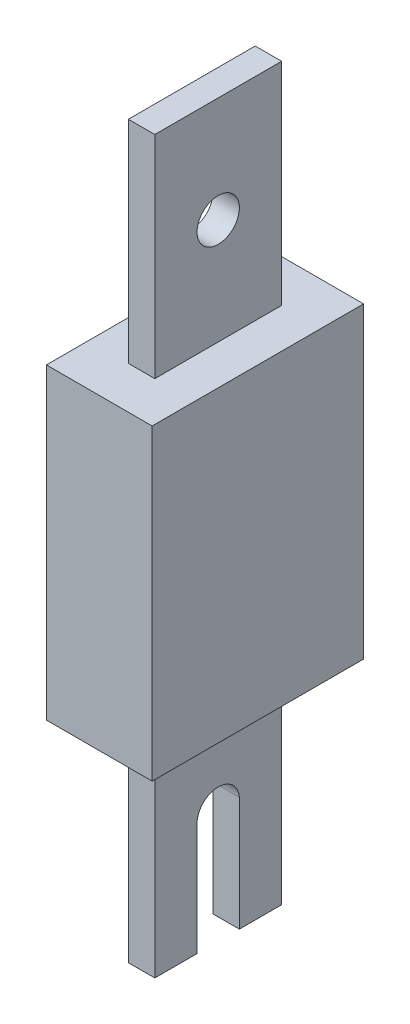
ISO-10303-21;
HEADER;
FILE_DESCRIPTION(('STEP AP214'),'2;1');
FILE_NAME('part.step','',(''),(''),'','','');
FILE_SCHEMA(('AUTOMOTIVE_DESIGN { 1 0 10303 214 1 1 1 1 }'));
ENDSEC;
DATA;
#1=APPLICATION_CONTEXT('core data for automotive mechanical design processes');
#2=APPLICATION_PROTOCOL_DEFINITION('international standard','automotive_design',2000,#1);
#3=PRODUCT_CONTEXT('',#1,'mechanical');
#4=PRODUCT('Part','Part','',(#3));
#5=PRODUCT_RELATED_PRODUCT_CATEGORY('part','',(#4));
#6=PRODUCT_DEFINITION_FORMATION('','',#4);
#7=PRODUCT_DEFINITION_CONTEXT('part definition',#1,'design');
#8=PRODUCT_DEFINITION('design','',#6,#7);
#9=PRODUCT_DEFINITION_SHAPE('','',#8);
#10=(LENGTH_UNIT() NAMED_UNIT(*) SI_UNIT(.MILLI.,.METRE.));
#11=(NAMED_UNIT(*) PLANE_ANGLE_UNIT() SI_UNIT($,.RADIAN.));
#12=(NAMED_UNIT(*) SI_UNIT($,.STERADIAN.) SOLID_ANGLE_UNIT());
#13=UNCERTAINTY_MEASURE_WITH_UNIT(LENGTH_MEASURE(1.E-05),#10,'distance_accuracy_value','');
#14=(GEOMETRIC_REPRESENTATION_CONTEXT(3) GLOBAL_UNCERTAINTY_ASSIGNED_CONTEXT((#13)) GLOBAL_UNIT_ASSIGNED_CONTEXT((#10,
#11,#12)) REPRESENTATION_CONTEXT('',''));
#15=CARTESIAN_POINT('',(0.,0.,0.));
#16=DIRECTION('',(0.,0.,1.));
#17=DIRECTION('',(1.,0.,0.));
#18=AXIS2_PLACEMENT_3D('',#15,#16,#17);
#19=CARTESIAN_POINT('',(-16.21295552744,48.217601526628,10.));
#20=DIRECTION('',(-1.,0.,0.));
#21=DIRECTION('',(0.,0.,1.));
#22=AXIS2_PLACEMENT_3D('',#19,#20,#21);
#23=CYLINDRICAL_SURFACE('',#22,2.);
#24=CARTESIAN_POINT('',(-13.71295552744,48.217601526628,10.));
#25=DIRECTION('',(-1.,0.,0.));
#26=DIRECTION('',(0.,0.,1.));
#27=AXIS2_PLACEMENT_3D('',#24,#25,#26);
#28=CIRCLE('',#27,2.);
#29=CARTESIAN_POINT('',(-13.71295552744,48.217601526628,12.));
#30=VERTEX_POINT('',#29);
#31=EDGE_CURVE('E20',#30,#30,#28,.T.);
#32=ORIENTED_EDGE('',*,*,#31,.F.);
#33=EDGE_LOOP('',(#32));
#34=FACE_BOUND('',#33,.T.);
#35=CARTESIAN_POINT('',(-16.21295552744,48.217601526628,10.));
#36=DIRECTION('',(-1.,0.,0.));
#37=DIRECTION('',(0.,0.,1.));
#38=AXIS2_PLACEMENT_3D('',#35,#36,#37);
#39=CIRCLE('',#38,2.);
#40=CARTESIAN_POINT('',(-16.21295552744,48.217601526628,12.));
#41=VERTEX_POINT('',#40);
#42=EDGE_CURVE('E176',#41,#41,#39,.T.);
#43=ORIENTED_EDGE('',*,*,#42,.T.);
#44=EDGE_LOOP('',(#43));
#45=FACE_BOUND('',#44,.T.);
#46=ADVANCED_FACE('F17',(#34,#45),#23,.F.);
#47=CARTESIAN_POINT('',(-16.21295552744,58.217601526628,20.));
#48=DIRECTION('',(0.,1.,0.));
#49=DIRECTION('',(0.,0.,1.));
#50=AXIS2_PLACEMENT_3D('',#47,#48,#49);
#51=PLANE('',#50);
#52=DIRECTION('',(1.,0.,0.));
#53=VECTOR('',#52,1.);
#54=CARTESIAN_POINT('',(3.787044472554,58.217601526628,16.));
#55=LINE('',#54,#53);
#56=CARTESIAN_POINT('',(-16.21295552744,58.217601526628,16.));
#57=VERTEX_POINT('',#56);
#58=CARTESIAN_POINT('',(-13.71295552744,58.217601526628,16.));
#59=VERTEX_POINT('',#58);
#60=EDGE_CURVE('E179',#57,#59,#55,.T.);
#61=ORIENTED_EDGE('',*,*,#60,.T.);
#62=DIRECTION('',(0.,0.,1.));
#63=VECTOR('',#62,1.);
#64=CARTESIAN_POINT('',(-13.71295552744,58.217601526628,20.));
#65=LINE('',#64,#63);
#66=CARTESIAN_POINT('',(-13.71295552744,58.217601526628,4.));
#67=VERTEX_POINT('',#66);
#68=EDGE_CURVE('E181',#67,#59,#65,.T.);
#69=ORIENTED_EDGE('',*,*,#68,.F.);
#70=DIRECTION('',(1.,0.,0.));
#71=VECTOR('',#70,1.);
#72=CARTESIAN_POINT('',(3.787044472554,58.217601526628,4.));
#73=LINE('',#72,#71);
#74=CARTESIAN_POINT('',(-16.21295552744,58.217601526628,4.));
#75=VERTEX_POINT('',#74);
#76=EDGE_CURVE('E187',#67,#75,#73,.F.);
#77=ORIENTED_EDGE('',*,*,#76,.T.);
#78=DIRECTION('',(0.,0.,1.));
#79=VECTOR('',#78,1.);
#80=CARTESIAN_POINT('',(-16.21295552744,58.217601526628,20.));
#81=LINE('',#80,#79);
#82=EDGE_CURVE('E166',#75,#57,#81,.T.);
#83=ORIENTED_EDGE('',*,*,#82,.T.);
#84=EDGE_LOOP('',(#61,#69,#77,#83));
#85=FACE_BOUND('',#84,.T.);
#86=ADVANCED_FACE('F384',(#85),#51,.T.);
#87=CARTESIAN_POINT('',(0.,-10.88239847337,20.));
#88=DIRECTION('',(0.,1.,0.));
#89=DIRECTION('',(0.,0.,1.));
#90=AXIS2_PLACEMENT_3D('',#87,#88,#89);
#91=PLANE('',#90);
#92=DIRECTION('',(-1.,0.,0.));
#93=VECTOR('',#92,1.);
#94=CARTESIAN_POINT('',(-6.212955527446,-10.88239847337,8.));
#95=LINE('',#94,#93);
#96=CARTESIAN_POINT('',(-13.71295552744,-10.88239847337,8.));
#97=VERTEX_POINT('',#96);
#98=CARTESIAN_POINT('',(-16.21295552744,-10.88239847337,8.));
#99=VERTEX_POINT('',#98);
#100=EDGE_CURVE('E140',#97,#99,#95,.T.);
#101=ORIENTED_EDGE('',*,*,#100,.T.);
#102=DIRECTION('',(0.,0.,1.));
#103=VECTOR('',#102,1.);
#104=CARTESIAN_POINT('',(-16.21295552744,-10.88239847337,20.));
#105=LINE('',#104,#103);
#106=CARTESIAN_POINT('',(-16.21295552744,-10.88239847337,4.));
#107=VERTEX_POINT('',#106);
#108=EDGE_CURVE('E154',#107,#99,#105,.T.);
#109=ORIENTED_EDGE('',*,*,#108,.F.);
#110=DIRECTION('',(1.,0.,0.));
#111=VECTOR('',#110,1.);
#112=CARTESIAN_POINT('',(3.787044472554,-10.88239847337,4.));
#113=LINE('',#112,#111);
#114=CARTESIAN_POINT('',(-13.71295552744,-10.88239847337,4.));
#115=VERTEX_POINT('',#114);
#116=EDGE_CURVE('E210',#107,#115,#113,.T.);
#117=ORIENTED_EDGE('',*,*,#116,.T.);
#118=DIRECTION('',(0.,0.,1.));
#119=VECTOR('',#118,1.);
#120=CARTESIAN_POINT('',(-13.71295552744,-10.88239847337,20.));
#121=LINE('',#120,#119);
#122=EDGE_CURVE('E203',#115,#97,#121,.T.);
#123=ORIENTED_EDGE('',*,*,#122,.T.);
#124=EDGE_LOOP('',(#101,#109,#117,#123));
#125=FACE_BOUND('',#124,.T.);
#126=ADVANCED_FACE('F386',(#125),#91,.F.);
#127=CARTESIAN_POINT('',(-6.212955527446,-0.08225252338699,8.));
#128=DIRECTION('',(0.,0.,-1.));
#129=DIRECTION('',(-1.,0.,0.));
#130=AXIS2_PLACEMENT_3D('',#127,#128,#129);
#131=PLANE('',#130);
#132=DIRECTION('',(0.,-1.,0.));
#133=VECTOR('',#132,1.);
#134=CARTESIAN_POINT('',(-16.21295552744,0.,8.));
#135=LINE('',#134,#133);
#136=CARTESIAN_POINT('',(-16.21295552744,-0.0822525233855761,7.99999999999989));
#137=VERTEX_POINT('',#136);
#138=EDGE_CURVE('E133',#99,#137,#135,.F.);
#139=ORIENTED_EDGE('',*,*,#138,.F.);
#140=ORIENTED_EDGE('',*,*,#100,.F.);
#141=DIRECTION('',(0.,-1.,0.));
#142=VECTOR('',#141,1.);
#143=CARTESIAN_POINT('',(-13.71295552744,0.,8.));
#144=LINE('',#143,#142);
#145=CARTESIAN_POINT('',(-13.71295552744,-0.0822525233855766,7.99999999999989));
#146=VERTEX_POINT('',#145);
#147=EDGE_CURVE('E136',#97,#146,#144,.F.);
#148=ORIENTED_EDGE('',*,*,#147,.T.);
#149=DIRECTION('',(-1.,0.,0.));
#150=VECTOR('',#149,1.);
#151=CARTESIAN_POINT('',(-6.212955527446,-0.082252523386974,7.99999999999978));
#152=LINE('',#151,#150);
#153=EDGE_CURVE('E128',#146,#137,#152,.T.);
#154=ORIENTED_EDGE('',*,*,#153,.T.);
#155=EDGE_LOOP('',(#139,#140,#148,#154));
#156=FACE_BOUND('',#155,.T.);
#157=ADVANCED_FACE('F130',(#156),#131,.F.);
#158=CARTESIAN_POINT('',(-6.212955527446,-0.237453291223,10.));
#159=DIRECTION('',(-1.,0.,0.));
#160=DIRECTION('',(0.,-1.,0.));
#161=AXIS2_PLACEMENT_3D('',#158,#159,#160);
#162=CYLINDRICAL_SURFACE('',#161,2.0060127812);
#163=CARTESIAN_POINT('',(-16.21295552744,-0.237453291222998,10.));
#164=DIRECTION('',(-1.,0.,0.));
#165=DIRECTION('',(0.,-1.,0.));
#166=AXIS2_PLACEMENT_3D('',#163,#164,#165);
#167=CIRCLE('',#166,2.0060127812);
#168=CARTESIAN_POINT('',(-16.21295552744,-0.082252523385585,12.));
#169=VERTEX_POINT('',#168);
#170=EDGE_CURVE('E144',#137,#169,#167,.F.);
#171=ORIENTED_EDGE('',*,*,#170,.F.);
#172=ORIENTED_EDGE('',*,*,#153,.F.);
#173=CARTESIAN_POINT('',(-13.71295552744,-0.237453291222999,10.));
#174=DIRECTION('',(-1.,0.,0.));
#175=DIRECTION('',(0.,-1.,0.));
#176=AXIS2_PLACEMENT_3D('',#173,#174,#175);
#177=CIRCLE('',#176,2.0060127812);
#178=CARTESIAN_POINT('',(-13.71295552744,-0.0822525233855853,12.));
#179=VERTEX_POINT('',#178);
#180=EDGE_CURVE('E239',#146,#179,#177,.F.);
#181=ORIENTED_EDGE('',*,*,#180,.T.);
#182=DIRECTION('',(1.,0.,0.));
#183=VECTOR('',#182,1.);
#184=CARTESIAN_POINT('',(-6.212955527446,-0.08225252338699,12.));
#185=LINE('',#184,#183);
#186=EDGE_CURVE('E139',#179,#169,#185,.F.);
#187=ORIENTED_EDGE('',*,*,#186,.T.);
#188=EDGE_LOOP('',(#171,#172,#181,#187));
#189=FACE_BOUND('',#188,.T.);
#190=ADVANCED_FACE('F145',(#189),#162,.F.);
#191=CARTESIAN_POINT('',(-6.212955527446,-0.08225252338699,12.));
#192=DIRECTION('',(0.,0.,1.));
#193=DIRECTION('',(1.,0.,0.));
#194=AXIS2_PLACEMENT_3D('',#191,#192,#193);
#195=PLANE('',#194);
#196=DIRECTION('',(0.,-1.,0.));
#197=VECTOR('',#196,1.);
#198=CARTESIAN_POINT('',(-16.21295552744,0.,12.));
#199=LINE('',#198,#197);
#200=CARTESIAN_POINT('',(-16.21295552744,-10.88239847337,12.));
#201=VERTEX_POINT('',#200);
#202=EDGE_CURVE('E164',#169,#201,#199,.T.);
#203=ORIENTED_EDGE('',*,*,#202,.F.);
#204=ORIENTED_EDGE('',*,*,#186,.F.);
#205=DIRECTION('',(0.,-1.,0.));
#206=VECTOR('',#205,1.);
#207=CARTESIAN_POINT('',(-13.71295552744,0.,12.));
#208=LINE('',#207,#206);
#209=CARTESIAN_POINT('',(-13.71295552744,-10.88239847337,12.));
#210=VERTEX_POINT('',#209);
#211=EDGE_CURVE('E197',#179,#210,#208,.T.);
#212=ORIENTED_EDGE('',*,*,#211,.T.);
#213=DIRECTION('',(1.,0.,0.));
#214=VECTOR('',#213,1.);
#215=CARTESIAN_POINT('',(0.,-10.88239847337,12.));
#216=LINE('',#215,#214);
#217=EDGE_CURVE('E189',#210,#201,#216,.F.);
#218=ORIENTED_EDGE('',*,*,#217,.T.);
#219=EDGE_LOOP('',(#203,#204,#212,#218));
#220=FACE_BOUND('',#219,.T.);
#221=ADVANCED_FACE('F325',(#220),#195,.F.);
#222=CARTESIAN_POINT('',(0.,-10.88239847337,20.));
#223=DIRECTION('',(0.,1.,0.));
#224=DIRECTION('',(0.,0.,1.));
#225=AXIS2_PLACEMENT_3D('',#222,#223,#224);
#226=PLANE('',#225);
#227=ORIENTED_EDGE('',*,*,#217,.F.);
#228=DIRECTION('',(0.,0.,1.));
#229=VECTOR('',#228,1.);
#230=CARTESIAN_POINT('',(-13.71295552744,-10.88239847337,20.));
#231=LINE('',#230,#229);
#232=CARTESIAN_POINT('',(-13.71295552744,-10.88239847337,16.));
#233=VERTEX_POINT('',#232);
#234=EDGE_CURVE('E194',#210,#233,#231,.T.);
#235=ORIENTED_EDGE('',*,*,#234,.T.);
#236=DIRECTION('',(1.,0.,0.));
#237=VECTOR('',#236,1.);
#238=CARTESIAN_POINT('',(3.787044472554,-10.88239847337,16.));
#239=LINE('',#238,#237);
#240=CARTESIAN_POINT('',(-16.21295552744,-10.88239847337,16.));
#241=VERTEX_POINT('',#240);
#242=EDGE_CURVE('E315',#233,#241,#239,.F.);
#243=ORIENTED_EDGE('',*,*,#242,.T.);
#244=DIRECTION('',(0.,0.,1.));
#245=VECTOR('',#244,1.);
#246=CARTESIAN_POINT('',(-16.21295552744,-10.88239847337,20.));
#247=LINE('',#246,#245);
#248=EDGE_CURVE('E156',#201,#241,#247,.T.);
#249=ORIENTED_EDGE('',*,*,#248,.F.);
#250=EDGE_LOOP('',(#227,#235,#243,#249));
#251=FACE_BOUND('',#250,.T.);
#252=ADVANCED_FACE('F328',(#251),#226,.F.);
#253=CARTESIAN_POINT('',(3.787044472554,58.217601526628,4.));
#254=DIRECTION('',(0.,0.,1.));
#255=DIRECTION('',(0.,-1.,0.));
#256=AXIS2_PLACEMENT_3D('',#253,#254,#255);
#257=PLANE('',#256);
#258=DIRECTION('',(1.,0.,0.));
#259=VECTOR('',#258,1.);
#260=CARTESIAN_POINT('',(0.,38.217601526628,4.));
#261=LINE('',#260,#259);
#262=CARTESIAN_POINT('',(-16.21295552744,38.217601526628,4.));
#263=VERTEX_POINT('',#262);
#264=CARTESIAN_POINT('',(-13.71295552744,38.217601526628,4.));
#265=VERTEX_POINT('',#264);
#266=EDGE_CURVE('E337',#263,#265,#261,.T.);
#267=ORIENTED_EDGE('',*,*,#266,.F.);
#268=DIRECTION('',(0.,1.,0.));
#269=VECTOR('',#268,1.);
#270=CARTESIAN_POINT('',(-16.21295552744,58.217601526628,4.));
#271=LINE('',#270,#269);
#272=EDGE_CURVE('E171',#263,#75,#271,.T.);
#273=ORIENTED_EDGE('',*,*,#272,.T.);
#274=ORIENTED_EDGE('',*,*,#76,.F.);
#275=DIRECTION('',(0.,1.,0.));
#276=VECTOR('',#275,1.);
#277=CARTESIAN_POINT('',(-13.71295552744,58.217601526628,4.));
#278=LINE('',#277,#276);
#279=EDGE_CURVE('E184',#265,#67,#278,.T.);
#280=ORIENTED_EDGE('',*,*,#279,.F.);
#281=EDGE_LOOP('',(#267,#273,#274,#280));
#282=FACE_BOUND('',#281,.T.);
#283=ADVANCED_FACE('F377',(#282),#257,.F.);
#284=CARTESIAN_POINT('',(-13.71295552744,58.217601526628,20.));
#285=DIRECTION('',(1.,0.,0.));
#286=DIRECTION('',(0.,1.,0.));
#287=AXIS2_PLACEMENT_3D('',#284,#285,#286);
#288=PLANE('',#287);
#289=DIRECTION('',(0.,1.,0.));
#290=VECTOR('',#289,1.);
#291=CARTESIAN_POINT('',(-13.71295552744,58.217601526628,16.));
#292=LINE('',#291,#290);
#293=CARTESIAN_POINT('',(-13.71295552744,38.217601526628,16.));
#294=VERTEX_POINT('',#293);
#295=EDGE_CURVE('E177',#59,#294,#292,.F.);
#296=ORIENTED_EDGE('',*,*,#295,.T.);
#297=DIRECTION('',(0.,0.,1.));
#298=VECTOR('',#297,1.);
#299=CARTESIAN_POINT('',(-13.71295552744,38.217601526628,20.));
#300=LINE('',#299,#298);
#301=EDGE_CURVE('E340',#265,#294,#300,.T.);
#302=ORIENTED_EDGE('',*,*,#301,.F.);
#303=ORIENTED_EDGE('',*,*,#279,.T.);
#304=ORIENTED_EDGE('',*,*,#68,.T.);
#305=EDGE_LOOP('',(#296,#302,#303,#304));
#306=FACE_BOUND('',#305,.T.);
#307=ORIENTED_EDGE('',*,*,#31,.T.);
#308=EDGE_LOOP('',(#307));
#309=FACE_BOUND('',#308,.T.);
#310=ADVANCED_FACE('F256',(#306,#309),#288,.T.);
#311=CARTESIAN_POINT('',(3.787044472554,58.217601526628,16.));
#312=DIRECTION('',(0.,0.,-1.));
#313=DIRECTION('',(0.,1.,0.));
#314=AXIS2_PLACEMENT_3D('',#311,#312,#313);
#315=PLANE('',#314);
#316=ORIENTED_EDGE('',*,*,#60,.F.);
#317=DIRECTION('',(0.,1.,0.));
#318=VECTOR('',#317,1.);
#319=CARTESIAN_POINT('',(-16.21295552744,58.217601526628,16.));
#320=LINE('',#319,#318);
#321=CARTESIAN_POINT('',(-16.21295552744,38.217601526628,16.));
#322=VERTEX_POINT('',#321);
#323=EDGE_CURVE('E174',#57,#322,#320,.F.);
#324=ORIENTED_EDGE('',*,*,#323,.T.);
#325=DIRECTION('',(1.,0.,0.));
#326=VECTOR('',#325,1.);
#327=CARTESIAN_POINT('',(0.,38.217601526628,16.));
#328=LINE('',#327,#326);
#329=EDGE_CURVE('E343',#294,#322,#328,.F.);
#330=ORIENTED_EDGE('',*,*,#329,.F.);
#331=ORIENTED_EDGE('',*,*,#295,.F.);
#332=EDGE_LOOP('',(#316,#324,#330,#331));
#333=FACE_BOUND('',#332,.T.);
#334=ADVANCED_FACE('F246',(#333),#315,.F.);
#335=CARTESIAN_POINT('',(-16.21295552744,58.217601526628,20.));
#336=DIRECTION('',(1.,0.,0.));
#337=DIRECTION('',(0.,1.,0.));
#338=AXIS2_PLACEMENT_3D('',#335,#336,#337);
#339=PLANE('',#338);
#340=ORIENTED_EDGE('',*,*,#272,.F.);
#341=DIRECTION('',(0.,0.,1.));
#342=VECTOR('',#341,1.);
#343=CARTESIAN_POINT('',(-16.21295552744,38.217601526628,20.));
#344=LINE('',#343,#342);
#345=EDGE_CURVE('E346',#322,#263,#344,.F.);
#346=ORIENTED_EDGE('',*,*,#345,.F.);
#347=ORIENTED_EDGE('',*,*,#323,.F.);
#348=ORIENTED_EDGE('',*,*,#82,.F.);
#349=EDGE_LOOP('',(#340,#346,#347,#348));
#350=FACE_BOUND('',#349,.T.);
#351=ORIENTED_EDGE('',*,*,#42,.F.);
#352=EDGE_LOOP('',(#351));
#353=FACE_BOUND('',#352,.T.);
#354=ADVANCED_FACE('F244',(#350,#353),#339,.F.);
#355=CARTESIAN_POINT('',(-16.21295552744,0.,20.));
#356=DIRECTION('',(-1.,0.,0.));
#357=DIRECTION('',(0.,-1.,0.));
#358=AXIS2_PLACEMENT_3D('',#355,#356,#357);
#359=PLANE('',#358);
#360=ORIENTED_EDGE('',*,*,#138,.T.);
#361=ORIENTED_EDGE('',*,*,#170,.T.);
#362=ORIENTED_EDGE('',*,*,#202,.T.);
#363=ORIENTED_EDGE('',*,*,#248,.T.);
#364=DIRECTION('',(0.,1.,0.));
#365=VECTOR('',#364,1.);
#366=CARTESIAN_POINT('',(-16.21295552744,-10.88239847337,16.));
#367=LINE('',#366,#365);
#368=CARTESIAN_POINT('',(-16.21295552744,9.117601526628,16.));
#369=VERTEX_POINT('',#368);
#370=EDGE_CURVE('E317',#241,#369,#367,.T.);
#371=ORIENTED_EDGE('',*,*,#370,.T.);
#372=DIRECTION('',(0.,0.,1.));
#373=VECTOR('',#372,1.);
#374=CARTESIAN_POINT('',(-16.21295552744,9.117601526628,20.));
#375=LINE('',#374,#373);
#376=CARTESIAN_POINT('',(-16.21295552744,9.117601526628,4.));
#377=VERTEX_POINT('',#376);
#378=EDGE_CURVE('E219',#369,#377,#375,.F.);
#379=ORIENTED_EDGE('',*,*,#378,.T.);
#380=DIRECTION('',(0.,-1.,0.));
#381=VECTOR('',#380,1.);
#382=CARTESIAN_POINT('',(-16.21295552744,-10.88239847337,4.));
#383=LINE('',#382,#381);
#384=EDGE_CURVE('E150',#377,#107,#383,.T.);
#385=ORIENTED_EDGE('',*,*,#384,.T.);
#386=ORIENTED_EDGE('',*,*,#108,.T.);
#387=EDGE_LOOP('',(#360,#361,#362,#363,#371,#379,#385,#386));
#388=FACE_BOUND('',#387,.T.);
#389=ADVANCED_FACE('F152',(#388),#359,.T.);
#390=CARTESIAN_POINT('',(3.787044472554,-10.88239847337,4.));
#391=DIRECTION('',(0.,0.,1.));
#392=DIRECTION('',(0.,-1.,0.));
#393=AXIS2_PLACEMENT_3D('',#390,#391,#392);
#394=PLANE('',#393);
#395=ORIENTED_EDGE('',*,*,#384,.F.);
#396=DIRECTION('',(-1.,0.,0.));
#397=VECTOR('',#396,1.);
#398=CARTESIAN_POINT('',(0.,9.117601526628,4.));
#399=LINE('',#398,#397);
#400=CARTESIAN_POINT('',(-13.71295552744,9.117601526628,4.));
#401=VERTEX_POINT('',#400);
#402=EDGE_CURVE('E216',#377,#401,#399,.F.);
#403=ORIENTED_EDGE('',*,*,#402,.T.);
#404=DIRECTION('',(0.,-1.,0.));
#405=VECTOR('',#404,1.);
#406=CARTESIAN_POINT('',(-13.71295552744,0.,4.));
#407=LINE('',#406,#405);
#408=EDGE_CURVE('E205',#401,#115,#407,.T.);
#409=ORIENTED_EDGE('',*,*,#408,.T.);
#410=ORIENTED_EDGE('',*,*,#116,.F.);
#411=EDGE_LOOP('',(#395,#403,#409,#410));
#412=FACE_BOUND('',#411,.T.);
#413=ADVANCED_FACE('F254',(#412),#394,.F.);
#414=CARTESIAN_POINT('',(-13.71295552744,0.,20.));
#415=DIRECTION('',(-1.,0.,0.));
#416=DIRECTION('',(0.,-1.,0.));
#417=AXIS2_PLACEMENT_3D('',#414,#415,#416);
#418=PLANE('',#417);
#419=ORIENTED_EDGE('',*,*,#211,.F.);
#420=ORIENTED_EDGE('',*,*,#180,.F.);
#421=ORIENTED_EDGE('',*,*,#147,.F.);
#422=ORIENTED_EDGE('',*,*,#122,.F.);
#423=ORIENTED_EDGE('',*,*,#408,.F.);
#424=DIRECTION('',(0.,0.,1.));
#425=VECTOR('',#424,1.);
#426=CARTESIAN_POINT('',(-13.71295552744,9.117601526628,20.));
#427=LINE('',#426,#425);
#428=CARTESIAN_POINT('',(-13.71295552744,9.117601526628,16.));
#429=VERTEX_POINT('',#428);
#430=EDGE_CURVE('E218',#401,#429,#427,.T.);
#431=ORIENTED_EDGE('',*,*,#430,.T.);
#432=DIRECTION('',(0.,1.,0.));
#433=VECTOR('',#432,1.);
#434=CARTESIAN_POINT('',(-13.71295552744,-10.88239847337,16.));
#435=LINE('',#434,#433);
#436=EDGE_CURVE('E196',#429,#233,#435,.F.);
#437=ORIENTED_EDGE('',*,*,#436,.T.);
#438=ORIENTED_EDGE('',*,*,#234,.F.);
#439=EDGE_LOOP('',(#419,#420,#421,#422,#423,#431,#437,#438));
#440=FACE_BOUND('',#439,.T.);
#441=ADVANCED_FACE('F290',(#440),#418,.F.);
#442=CARTESIAN_POINT('',(3.787044472554,-10.88239847337,16.));
#443=DIRECTION('',(0.,0.,-1.));
#444=DIRECTION('',(0.,1.,0.));
#445=AXIS2_PLACEMENT_3D('',#442,#443,#444);
#446=PLANE('',#445);
#447=ORIENTED_EDGE('',*,*,#370,.F.);
#448=ORIENTED_EDGE('',*,*,#242,.F.);
#449=ORIENTED_EDGE('',*,*,#436,.F.);
#450=DIRECTION('',(-1.,0.,0.));
#451=VECTOR('',#450,1.);
#452=CARTESIAN_POINT('',(0.,9.117601526628,16.));
#453=LINE('',#452,#451);
#454=EDGE_CURVE('E223',#429,#369,#453,.T.);
#455=ORIENTED_EDGE('',*,*,#454,.T.);
#456=EDGE_LOOP('',(#447,#448,#449,#455));
#457=FACE_BOUND('',#456,.T.);
#458=ADVANCED_FACE('F286',(#457),#446,.F.);
#459=CARTESIAN_POINT('',(-19.96295552744,0.,20.));
#460=DIRECTION('',(1.,0.,0.));
#461=DIRECTION('',(0.,1.,0.));
#462=AXIS2_PLACEMENT_3D('',#459,#460,#461);
#463=PLANE('',#462);
#464=DIRECTION('',(0.,0.,1.));
#465=VECTOR('',#464,1.);
#466=CARTESIAN_POINT('',(-19.96295552744,9.117601526628,20.));
#467=LINE('',#466,#465);
#468=CARTESIAN_POINT('',(-19.96295552744,9.117601526628,0.));
#469=VERTEX_POINT('',#468);
#470=CARTESIAN_POINT('',(-19.96295552744,9.117601526628,20.));
#471=VERTEX_POINT('',#470);
#472=EDGE_CURVE('E354',#469,#471,#467,.T.);
#473=ORIENTED_EDGE('',*,*,#472,.T.);
#474=DIRECTION('',(0.,1.,0.));
#475=VECTOR('',#474,1.);
#476=CARTESIAN_POINT('',(-19.96295552744,0.,20.));
#477=LINE('',#476,#475);
#478=CARTESIAN_POINT('',(-19.96295552744,38.217601526628,20.));
#479=VERTEX_POINT('',#478);
#480=EDGE_CURVE('E232',#479,#471,#477,.F.);
#481=ORIENTED_EDGE('',*,*,#480,.F.);
#482=DIRECTION('',(0.,0.,1.));
#483=VECTOR('',#482,1.);
#484=CARTESIAN_POINT('',(-19.96295552744,38.217601526628,20.));
#485=LINE('',#484,#483);
#486=CARTESIAN_POINT('',(-19.96295552744,38.217601526628,0.));
#487=VERTEX_POINT('',#486);
#488=EDGE_CURVE('E335',#487,#479,#485,.T.);
#489=ORIENTED_EDGE('',*,*,#488,.F.);
#490=DIRECTION('',(0.,1.,0.));
#491=VECTOR('',#490,1.);
#492=CARTESIAN_POINT('',(-19.96295552744,0.,0.));
#493=LINE('',#492,#491);
#494=EDGE_CURVE('E329',#487,#469,#493,.F.);
#495=ORIENTED_EDGE('',*,*,#494,.T.);
#496=EDGE_LOOP('',(#473,#481,#489,#495));
#497=FACE_BOUND('',#496,.T.);
#498=ADVANCED_FACE('F282',(#497),#463,.F.);
#499=CARTESIAN_POINT('',(0.,0.,0.));
#500=DIRECTION('',(0.,0.,1.));
#501=DIRECTION('',(1.,0.,0.));
#502=AXIS2_PLACEMENT_3D('',#499,#500,#501);
#503=PLANE('',#502);
#504=DIRECTION('',(0.,1.,0.));
#505=VECTOR('',#504,1.);
#506=CARTESIAN_POINT('',(-9.962955527446,0.,0.));
#507=LINE('',#506,#505);
#508=CARTESIAN_POINT('',(-9.962955527446,9.117601526628,0.));
#509=VERTEX_POINT('',#508);
#510=CARTESIAN_POINT('',(-9.962955527446,38.217601526628,0.));
#511=VERTEX_POINT('',#510);
#512=EDGE_CURVE('E360',#509,#511,#507,.T.);
#513=ORIENTED_EDGE('',*,*,#512,.F.);
#514=DIRECTION('',(-1.,0.,0.));
#515=VECTOR('',#514,1.);
#516=CARTESIAN_POINT('',(0.,9.117601526628,0.));
#517=LINE('',#516,#515);
#518=EDGE_CURVE('E357',#509,#469,#517,.T.);
#519=ORIENTED_EDGE('',*,*,#518,.T.);
#520=ORIENTED_EDGE('',*,*,#494,.F.);
#521=DIRECTION('',(1.,0.,0.));
#522=VECTOR('',#521,1.);
#523=CARTESIAN_POINT('',(0.,38.217601526628,0.));
#524=LINE('',#523,#522);
#525=EDGE_CURVE('E330',#511,#487,#524,.F.);
#526=ORIENTED_EDGE('',*,*,#525,.F.);
#527=EDGE_LOOP('',(#513,#519,#520,#526));
#528=FACE_BOUND('',#527,.T.);
#529=ADVANCED_FACE('F278',(#528),#503,.F.);
#530=CARTESIAN_POINT('',(0.,38.217601526628,20.));
#531=DIRECTION('',(0.,1.,0.));
#532=DIRECTION('',(0.,0.,1.));
#533=AXIS2_PLACEMENT_3D('',#530,#531,#532);
#534=PLANE('',#533);
#535=ORIENTED_EDGE('',*,*,#329,.T.);
#536=ORIENTED_EDGE('',*,*,#345,.T.);
#537=ORIENTED_EDGE('',*,*,#266,.T.);
#538=ORIENTED_EDGE('',*,*,#301,.T.);
#539=EDGE_LOOP('',(#535,#536,#537,#538));
#540=FACE_BOUND('',#539,.T.);
#541=ORIENTED_EDGE('',*,*,#488,.T.);
#542=DIRECTION('',(1.,0.,0.));
#543=VECTOR('',#542,1.);
#544=CARTESIAN_POINT('',(0.,38.217601526628,20.));
#545=LINE('',#544,#543);
#546=CARTESIAN_POINT('',(-9.962955527446,38.217601526628,20.));
#547=VERTEX_POINT('',#546);
#548=EDGE_CURVE('E349',#547,#479,#545,.F.);
#549=ORIENTED_EDGE('',*,*,#548,.F.);
#550=DIRECTION('',(0.,0.,1.));
#551=VECTOR('',#550,1.);
#552=CARTESIAN_POINT('',(-9.96295552744601,38.217601526628,20.));
#553=LINE('',#552,#551);
#554=EDGE_CURVE('E363',#511,#547,#553,.T.);
#555=ORIENTED_EDGE('',*,*,#554,.F.);
#556=ORIENTED_EDGE('',*,*,#525,.T.);
#557=EDGE_LOOP('',(#541,#549,#555,#556));
#558=FACE_BOUND('',#557,.T.);
#559=ADVANCED_FACE('F275',(#540,#558),#534,.T.);
#560=CARTESIAN_POINT('',(0.,0.,20.));
#561=DIRECTION('',(0.,0.,1.));
#562=DIRECTION('',(1.,0.,0.));
#563=AXIS2_PLACEMENT_3D('',#560,#561,#562);
#564=PLANE('',#563);
#565=ORIENTED_EDGE('',*,*,#548,.T.);
#566=ORIENTED_EDGE('',*,*,#480,.T.);
#567=DIRECTION('',(-1.,0.,0.));
#568=VECTOR('',#567,1.);
#569=CARTESIAN_POINT('',(0.,9.117601526628,20.));
#570=LINE('',#569,#568);
#571=CARTESIAN_POINT('',(-9.962955527446,9.117601526628,20.));
#572=VERTEX_POINT('',#571);
#573=EDGE_CURVE('E35',#471,#572,#570,.F.);
#574=ORIENTED_EDGE('',*,*,#573,.T.);
#575=DIRECTION('',(0.,1.,0.));
#576=VECTOR('',#575,1.);
#577=CARTESIAN_POINT('',(-9.962955527446,0.,20.));
#578=LINE('',#577,#576);
#579=EDGE_CURVE('E26',#547,#572,#578,.F.);
#580=ORIENTED_EDGE('',*,*,#579,.F.);
#581=EDGE_LOOP('',(#565,#566,#574,#580));
#582=FACE_BOUND('',#581,.T.);
#583=ADVANCED_FACE('F268',(#582),#564,.T.);
#584=CARTESIAN_POINT('',(0.,9.117601526628,20.));
#585=DIRECTION('',(0.,1.,0.));
#586=DIRECTION('',(-1.,0.,0.));
#587=AXIS2_PLACEMENT_3D('',#584,#585,#586);
#588=PLANE('',#587);
#589=DIRECTION('',(0.,0.,1.));
#590=VECTOR('',#589,1.);
#591=CARTESIAN_POINT('',(-9.962955527446,9.117601526628,20.));
#592=LINE('',#591,#590);
#593=EDGE_CURVE('E11',#572,#509,#592,.F.);
#594=ORIENTED_EDGE('',*,*,#593,.F.);
#595=ORIENTED_EDGE('',*,*,#573,.F.);
#596=ORIENTED_EDGE('',*,*,#472,.F.);
#597=ORIENTED_EDGE('',*,*,#518,.F.);
#598=EDGE_LOOP('',(#594,#595,#596,#597));
#599=FACE_BOUND('',#598,.T.);
#600=ORIENTED_EDGE('',*,*,#430,.F.);
#601=ORIENTED_EDGE('',*,*,#402,.F.);
#602=ORIENTED_EDGE('',*,*,#378,.F.);
#603=ORIENTED_EDGE('',*,*,#454,.F.);
#604=EDGE_LOOP('',(#600,#601,#602,#603));
#605=FACE_BOUND('',#604,.T.);
#606=ADVANCED_FACE('F262',(#599,#605),#588,.F.);
#607=CARTESIAN_POINT('',(-9.962955527446,0.,20.));
#608=DIRECTION('',(1.,0.,0.));
#609=DIRECTION('',(0.,1.,0.));
#610=AXIS2_PLACEMENT_3D('',#607,#608,#609);
#611=PLANE('',#610);
#612=ORIENTED_EDGE('',*,*,#579,.T.);
#613=ORIENTED_EDGE('',*,*,#593,.T.);
#614=ORIENTED_EDGE('',*,*,#512,.T.);
#615=ORIENTED_EDGE('',*,*,#554,.T.);
#616=EDGE_LOOP('',(#612,#613,#614,#615));
#617=FACE_BOUND('',#616,.T.);
#618=ADVANCED_FACE('F260',(#617),#611,.T.);
#619=CLOSED_SHELL('',(#46,#86,#126,#157,#190,#221,#252,#283,#310,#334,#354,#389,#413,#441,#458,
#498,#529,#559,#583,#606,#618));
#620=MANIFOLD_SOLID_BREP('B1',#619);
#621=ADVANCED_BREP_SHAPE_REPRESENTATION('',(#18,#620),#14);
#622=SHAPE_DEFINITION_REPRESENTATION(#9,#621);
ENDSEC;
END-ISO-10303-21;
